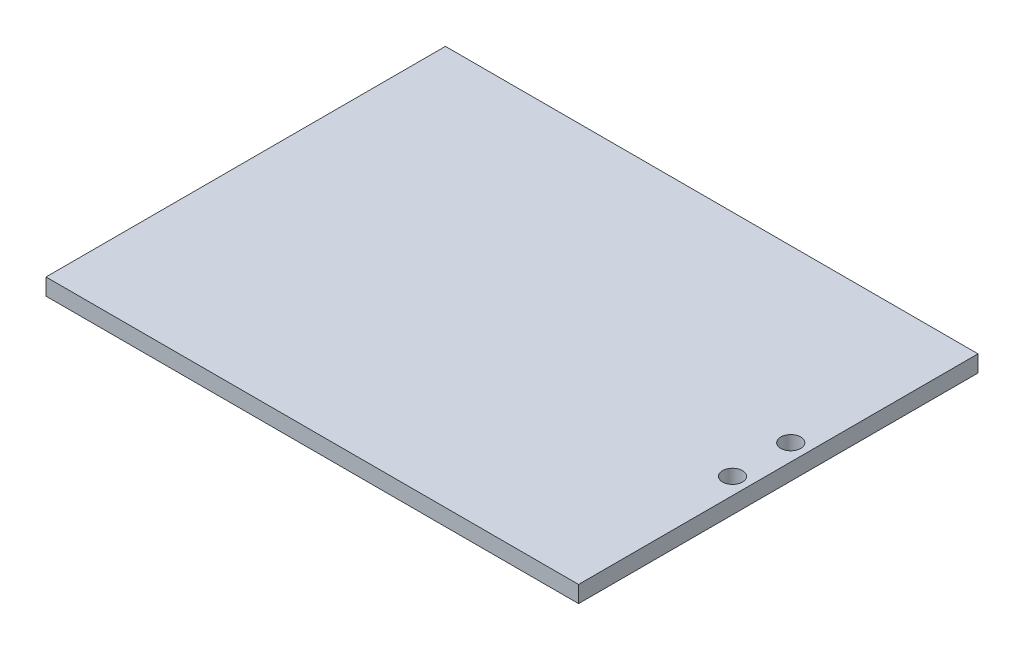
ISO-10303-21;
HEADER;
FILE_DESCRIPTION(('STEP AP214'),'2;1');
FILE_NAME('part.step','',(''),(''),'','','');
FILE_SCHEMA(('AUTOMOTIVE_DESIGN { 1 0 10303 214 1 1 1 1 }'));
ENDSEC;
DATA;
#1=APPLICATION_CONTEXT('core data for automotive mechanical design processes');
#2=APPLICATION_PROTOCOL_DEFINITION('international standard','automotive_design',2000,#1);
#3=PRODUCT_CONTEXT('',#1,'mechanical');
#4=PRODUCT('Part','Part','',(#3));
#5=PRODUCT_RELATED_PRODUCT_CATEGORY('part','',(#4));
#6=PRODUCT_DEFINITION_FORMATION('','',#4);
#7=PRODUCT_DEFINITION_CONTEXT('part definition',#1,'design');
#8=PRODUCT_DEFINITION('design','',#6,#7);
#9=PRODUCT_DEFINITION_SHAPE('','',#8);
#10=(LENGTH_UNIT() NAMED_UNIT(*) SI_UNIT(.MILLI.,.METRE.));
#11=(NAMED_UNIT(*) PLANE_ANGLE_UNIT() SI_UNIT($,.RADIAN.));
#12=(NAMED_UNIT(*) SI_UNIT($,.STERADIAN.) SOLID_ANGLE_UNIT());
#13=UNCERTAINTY_MEASURE_WITH_UNIT(LENGTH_MEASURE(1.E-05),#10,'distance_accuracy_value','');
#14=(GEOMETRIC_REPRESENTATION_CONTEXT(3) GLOBAL_UNCERTAINTY_ASSIGNED_CONTEXT((#13)) GLOBAL_UNIT_ASSIGNED_CONTEXT((#10,
#11,#12)) REPRESENTATION_CONTEXT('',''));
#15=CARTESIAN_POINT('',(0.,0.,0.));
#16=DIRECTION('',(0.,0.,1.));
#17=DIRECTION('',(1.,0.,0.));
#18=AXIS2_PLACEMENT_3D('',#15,#16,#17);
#19=CARTESIAN_POINT('',(50.8,3.175,-38.1));
#20=DIRECTION('',(-1.,0.,0.));
#21=DIRECTION('',(0.,0.,1.));
#22=AXIS2_PLACEMENT_3D('',#19,#20,#21);
#23=PLANE('',#22);
#24=DIRECTION('',(0.,0.,-1.));
#25=VECTOR('',#24,1.);
#26=CARTESIAN_POINT('',(50.8,0.,-38.1));
#27=LINE('',#26,#25);
#28=CARTESIAN_POINT('',(50.8,0.,38.1));
#29=VERTEX_POINT('',#28);
#30=CARTESIAN_POINT('',(50.8,0.,-38.1));
#31=VERTEX_POINT('',#30);
#32=EDGE_CURVE('E108',#29,#31,#27,.T.);
#33=ORIENTED_EDGE('',*,*,#32,.T.);
#34=DIRECTION('',(0.,-1.,0.));
#35=VECTOR('',#34,1.);
#36=CARTESIAN_POINT('',(50.8,3.175,-38.1));
#37=LINE('',#36,#35);
#38=CARTESIAN_POINT('',(50.8,3.175,-38.1));
#39=VERTEX_POINT('',#38);
#40=EDGE_CURVE('E11',#39,#31,#37,.T.);
#41=ORIENTED_EDGE('',*,*,#40,.F.);
#42=DIRECTION('',(0.,0.,-1.));
#43=VECTOR('',#42,1.);
#44=CARTESIAN_POINT('',(50.8,3.175,-38.1));
#45=LINE('',#44,#43);
#46=CARTESIAN_POINT('',(50.8,3.175,38.1));
#47=VERTEX_POINT('',#46);
#48=EDGE_CURVE('E91',#47,#39,#45,.T.);
#49=ORIENTED_EDGE('',*,*,#48,.F.);
#50=DIRECTION('',(0.,-1.,0.));
#51=VECTOR('',#50,1.);
#52=CARTESIAN_POINT('',(50.8,3.175,38.1));
#53=LINE('',#52,#51);
#54=EDGE_CURVE('E104',#47,#29,#53,.T.);
#55=ORIENTED_EDGE('',*,*,#54,.T.);
#56=EDGE_LOOP('',(#33,#41,#49,#55));
#57=FACE_BOUND('',#56,.T.);
#58=ADVANCED_FACE('F38',(#57),#23,.F.);
#59=CARTESIAN_POINT('',(-50.8,3.175,-38.1));
#60=DIRECTION('',(0.,0.,1.));
#61=DIRECTION('',(1.,0.,0.));
#62=AXIS2_PLACEMENT_3D('',#59,#60,#61);
#63=PLANE('',#62);
#64=DIRECTION('',(-1.,0.,0.));
#65=VECTOR('',#64,1.);
#66=CARTESIAN_POINT('',(-50.8,0.,-38.1));
#67=LINE('',#66,#65);
#68=CARTESIAN_POINT('',(-50.8,0.,-38.1));
#69=VERTEX_POINT('',#68);
#70=EDGE_CURVE('E96',#31,#69,#67,.T.);
#71=ORIENTED_EDGE('',*,*,#70,.T.);
#72=DIRECTION('',(0.,-1.,0.));
#73=VECTOR('',#72,1.);
#74=CARTESIAN_POINT('',(-50.8,3.175,-38.1));
#75=LINE('',#74,#73);
#76=CARTESIAN_POINT('',(-50.8,3.175,-38.1));
#77=VERTEX_POINT('',#76);
#78=EDGE_CURVE('E48',#77,#69,#75,.T.);
#79=ORIENTED_EDGE('',*,*,#78,.F.);
#80=DIRECTION('',(-1.,0.,0.));
#81=VECTOR('',#80,1.);
#82=CARTESIAN_POINT('',(-50.8,3.175,-38.1));
#83=LINE('',#82,#81);
#84=EDGE_CURVE('E86',#39,#77,#83,.T.);
#85=ORIENTED_EDGE('',*,*,#84,.F.);
#86=ORIENTED_EDGE('',*,*,#40,.T.);
#87=EDGE_LOOP('',(#71,#79,#85,#86));
#88=FACE_BOUND('',#87,.T.);
#89=ADVANCED_FACE('F95',(#88),#63,.F.);
#90=CARTESIAN_POINT('',(-50.8,3.175,-38.1));
#91=DIRECTION('',(1.,0.,0.));
#92=DIRECTION('',(0.,0.,-1.));
#93=AXIS2_PLACEMENT_3D('',#90,#91,#92);
#94=PLANE('',#93);
#95=DIRECTION('',(0.,0.,1.));
#96=VECTOR('',#95,1.);
#97=CARTESIAN_POINT('',(-50.8,0.,-38.1));
#98=LINE('',#97,#96);
#99=CARTESIAN_POINT('',(-50.8,0.,38.1));
#100=VERTEX_POINT('',#99);
#101=EDGE_CURVE('E73',#69,#100,#98,.T.);
#102=ORIENTED_EDGE('',*,*,#101,.T.);
#103=DIRECTION('',(0.,-1.,0.));
#104=VECTOR('',#103,1.);
#105=CARTESIAN_POINT('',(-50.8,3.175,38.1));
#106=LINE('',#105,#104);
#107=CARTESIAN_POINT('',(-50.8,3.175,38.1));
#108=VERTEX_POINT('',#107);
#109=EDGE_CURVE('E98',#108,#100,#106,.T.);
#110=ORIENTED_EDGE('',*,*,#109,.F.);
#111=DIRECTION('',(0.,0.,1.));
#112=VECTOR('',#111,1.);
#113=CARTESIAN_POINT('',(-50.8,3.175,-38.1));
#114=LINE('',#113,#112);
#115=EDGE_CURVE('E89',#77,#108,#114,.T.);
#116=ORIENTED_EDGE('',*,*,#115,.F.);
#117=ORIENTED_EDGE('',*,*,#78,.T.);
#118=EDGE_LOOP('',(#102,#110,#116,#117));
#119=FACE_BOUND('',#118,.T.);
#120=ADVANCED_FACE('F100',(#119),#94,.F.);
#121=CARTESIAN_POINT('',(-50.8,3.175,38.1));
#122=DIRECTION('',(0.,0.,-1.));
#123=DIRECTION('',(-1.,0.,0.));
#124=AXIS2_PLACEMENT_3D('',#121,#122,#123);
#125=PLANE('',#124);
#126=DIRECTION('',(1.,0.,0.));
#127=VECTOR('',#126,1.);
#128=CARTESIAN_POINT('',(-50.8,0.,38.1));
#129=LINE('',#128,#127);
#130=EDGE_CURVE('E79',#100,#29,#129,.T.);
#131=ORIENTED_EDGE('',*,*,#130,.T.);
#132=ORIENTED_EDGE('',*,*,#54,.F.);
#133=DIRECTION('',(1.,0.,0.));
#134=VECTOR('',#133,1.);
#135=CARTESIAN_POINT('',(-50.8,3.175,38.1));
#136=LINE('',#135,#134);
#137=EDGE_CURVE('E56',#108,#47,#136,.T.);
#138=ORIENTED_EDGE('',*,*,#137,.F.);
#139=ORIENTED_EDGE('',*,*,#109,.T.);
#140=EDGE_LOOP('',(#131,#132,#138,#139));
#141=FACE_BOUND('',#140,.T.);
#142=ADVANCED_FACE('F122',(#141),#125,.F.);
#143=CARTESIAN_POINT('',(0.,3.175,0.));
#144=DIRECTION('',(0.,1.,0.));
#145=DIRECTION('',(0.,0.,1.));
#146=AXIS2_PLACEMENT_3D('',#143,#144,#145);
#147=PLANE('',#146);
#148=CARTESIAN_POINT('',(47.625,3.175,-5.55625));
#149=DIRECTION('',(0.,1.,0.));
#150=DIRECTION('',(0.,0.,1.));
#151=AXIS2_PLACEMENT_3D('',#148,#149,#150);
#152=CIRCLE('',#151,1.89864999999999);
#153=CARTESIAN_POINT('',(47.625,3.175,-3.65760000000001));
#154=VERTEX_POINT('',#153);
#155=EDGE_CURVE('E136',#154,#154,#152,.T.);
#156=ORIENTED_EDGE('',*,*,#155,.F.);
#157=EDGE_LOOP('',(#156));
#158=FACE_BOUND('',#157,.T.);
#159=CARTESIAN_POINT('',(47.625,3.175,5.55625));
#160=DIRECTION('',(0.,1.,0.));
#161=DIRECTION('',(0.,0.,1.));
#162=AXIS2_PLACEMENT_3D('',#159,#160,#161);
#163=CIRCLE('',#162,1.89864999999999);
#164=CARTESIAN_POINT('',(47.625,3.175,7.45489999999999));
#165=VERTEX_POINT('',#164);
#166=EDGE_CURVE('E132',#165,#165,#163,.T.);
#167=ORIENTED_EDGE('',*,*,#166,.F.);
#168=EDGE_LOOP('',(#167));
#169=FACE_BOUND('',#168,.T.);
#170=ORIENTED_EDGE('',*,*,#48,.T.);
#171=ORIENTED_EDGE('',*,*,#84,.T.);
#172=ORIENTED_EDGE('',*,*,#115,.T.);
#173=ORIENTED_EDGE('',*,*,#137,.T.);
#174=EDGE_LOOP('',(#170,#171,#172,#173));
#175=FACE_BOUND('',#174,.T.);
#176=ADVANCED_FACE('F87',(#158,#169,#175),#147,.T.);
#177=CARTESIAN_POINT('',(0.,0.,0.));
#178=DIRECTION('',(0.,1.,0.));
#179=DIRECTION('',(0.,0.,1.));
#180=AXIS2_PLACEMENT_3D('',#177,#178,#179);
#181=PLANE('',#180);
#182=CARTESIAN_POINT('',(47.625,0.,-5.55625));
#183=DIRECTION('',(0.,1.,0.));
#184=DIRECTION('',(0.,0.,1.));
#185=AXIS2_PLACEMENT_3D('',#182,#183,#184);
#186=CIRCLE('',#185,1.89864999999999);
#187=CARTESIAN_POINT('',(47.625,0.,-3.65760000000001));
#188=VERTEX_POINT('',#187);
#189=EDGE_CURVE('E41',#188,#188,#186,.T.);
#190=ORIENTED_EDGE('',*,*,#189,.T.);
#191=EDGE_LOOP('',(#190));
#192=FACE_BOUND('',#191,.T.);
#193=CARTESIAN_POINT('',(47.625,0.,5.55625));
#194=DIRECTION('',(0.,1.,0.));
#195=DIRECTION('',(0.,0.,1.));
#196=AXIS2_PLACEMENT_3D('',#193,#194,#195);
#197=CIRCLE('',#196,1.89864999999999);
#198=CARTESIAN_POINT('',(47.625,0.,7.45489999999999));
#199=VERTEX_POINT('',#198);
#200=EDGE_CURVE('E112',#199,#199,#197,.T.);
#201=ORIENTED_EDGE('',*,*,#200,.T.);
#202=EDGE_LOOP('',(#201));
#203=FACE_BOUND('',#202,.T.);
#204=ORIENTED_EDGE('',*,*,#32,.F.);
#205=ORIENTED_EDGE('',*,*,#130,.F.);
#206=ORIENTED_EDGE('',*,*,#101,.F.);
#207=ORIENTED_EDGE('',*,*,#70,.F.);
#208=EDGE_LOOP('',(#204,#205,#206,#207));
#209=FACE_BOUND('',#208,.T.);
#210=ADVANCED_FACE('F125',(#192,#203,#209),#181,.F.);
#211=CARTESIAN_POINT('',(47.625,3.175,5.55625));
#212=DIRECTION('',(0.,1.,0.));
#213=DIRECTION('',(0.,0.,1.));
#214=AXIS2_PLACEMENT_3D('',#211,#212,#213);
#215=CYLINDRICAL_SURFACE('',#214,1.89864999999999);
#216=ORIENTED_EDGE('',*,*,#166,.T.);
#217=EDGE_LOOP('',(#216));
#218=FACE_BOUND('',#217,.T.);
#219=ORIENTED_EDGE('',*,*,#200,.F.);
#220=EDGE_LOOP('',(#219));
#221=FACE_BOUND('',#220,.T.);
#222=ADVANCED_FACE('F149',(#218,#221),#215,.F.);
#223=CARTESIAN_POINT('',(47.625,3.175,-5.55625));
#224=DIRECTION('',(0.,1.,0.));
#225=DIRECTION('',(0.,0.,1.));
#226=AXIS2_PLACEMENT_3D('',#223,#224,#225);
#227=CYLINDRICAL_SURFACE('',#226,1.89864999999999);
#228=ORIENTED_EDGE('',*,*,#155,.T.);
#229=EDGE_LOOP('',(#228));
#230=FACE_BOUND('',#229,.T.);
#231=ORIENTED_EDGE('',*,*,#189,.F.);
#232=EDGE_LOOP('',(#231));
#233=FACE_BOUND('',#232,.T.);
#234=ADVANCED_FACE('F147',(#230,#233),#227,.F.);
#235=CLOSED_SHELL('',(#58,#89,#120,#142,#176,#210,#222,#234));
#236=MANIFOLD_SOLID_BREP('B2',#235);
#237=ADVANCED_BREP_SHAPE_REPRESENTATION('',(#18,#236),#14);
#238=SHAPE_DEFINITION_REPRESENTATION(#9,#237);
ENDSEC;
END-ISO-10303-21;
